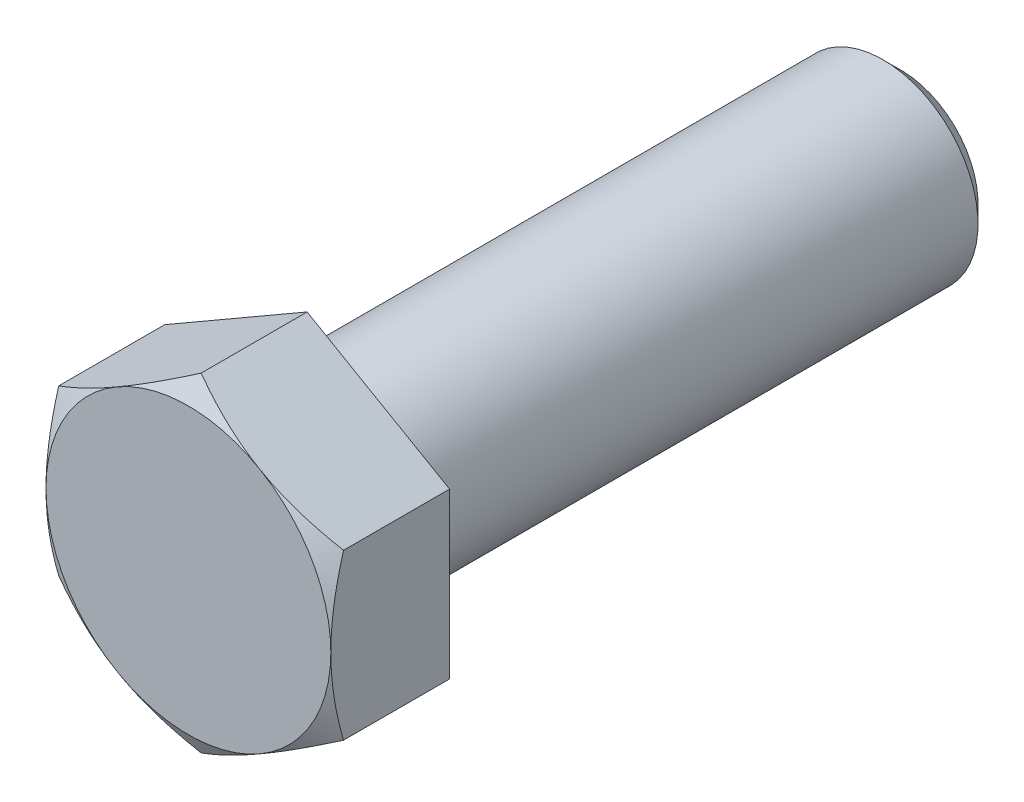
ISO-10303-21;
HEADER;
FILE_DESCRIPTION(('STEP AP214'),'2;1');
FILE_NAME('part.step','',(''),(''),'','','');
FILE_SCHEMA(('AUTOMOTIVE_DESIGN { 1 0 10303 214 1 1 1 1 }'));
ENDSEC;
DATA;
#1=APPLICATION_CONTEXT('core data for automotive mechanical design processes');
#2=APPLICATION_PROTOCOL_DEFINITION('international standard','automotive_design',2000,#1);
#3=PRODUCT_CONTEXT('',#1,'mechanical');
#4=PRODUCT('Part','Part','',(#3));
#5=PRODUCT_RELATED_PRODUCT_CATEGORY('part','',(#4));
#6=PRODUCT_DEFINITION_FORMATION('','',#4);
#7=PRODUCT_DEFINITION_CONTEXT('part definition',#1,'design');
#8=PRODUCT_DEFINITION('design','',#6,#7);
#9=PRODUCT_DEFINITION_SHAPE('','',#8);
#10=(LENGTH_UNIT() NAMED_UNIT(*) SI_UNIT(.MILLI.,.METRE.));
#11=(NAMED_UNIT(*) PLANE_ANGLE_UNIT() SI_UNIT($,.RADIAN.));
#12=(NAMED_UNIT(*) SI_UNIT($,.STERADIAN.) SOLID_ANGLE_UNIT());
#13=UNCERTAINTY_MEASURE_WITH_UNIT(LENGTH_MEASURE(1.E-05),#10,'distance_accuracy_value','');
#14=(GEOMETRIC_REPRESENTATION_CONTEXT(3) GLOBAL_UNCERTAINTY_ASSIGNED_CONTEXT((#13)) GLOBAL_UNIT_ASSIGNED_CONTEXT((#10,
#11,#12)) REPRESENTATION_CONTEXT('',''));
#15=CARTESIAN_POINT('',(0.,0.,0.));
#16=DIRECTION('',(0.,0.,1.));
#17=DIRECTION('',(1.,0.,0.));
#18=AXIS2_PLACEMENT_3D('',#15,#16,#17);
#19=CARTESIAN_POINT('',(-11.9944518424145,-6.925,9.99999999999999));
#20=DIRECTION('',(1.,0.,0.));
#21=DIRECTION('',(0.,0.,-1.));
#22=AXIS2_PLACEMENT_3D('',#19,#20,#21);
#23=PLANE('',#22);
#24=CARTESIAN_POINT('',(-11.9944518424145,-18.916651266714,3.99304255411589));
#25=CARTESIAN_POINT('',(-11.9944518424145,-18.65332713006,4.12143548843301));
#26=CARTESIAN_POINT('',(-11.9944518424145,-18.389702350382,4.24921154158443));
#27=CARTESIAN_POINT('',(-11.9944518424145,-17.8617888659462,4.50339074864757));
#28=CARTESIAN_POINT('',(-11.9944518424145,-17.5975001549837,4.62979388966998));
#29=CARTESIAN_POINT('',(-11.9944518424145,-16.8034779537679,5.00676659385935));
#30=CARTESIAN_POINT('',(-11.9944518424145,-16.2726616224978,5.2550636391158));
#31=CARTESIAN_POINT('',(-11.9944518424145,-15.2048398758484,5.74542434972927));
#32=CARTESIAN_POINT('',(-11.9944518424145,-14.6678166677863,5.98744935838821));
#33=CARTESIAN_POINT('',(-11.9944518424145,-13.5896076882344,6.46200912800229));
#34=CARTESIAN_POINT('',(-11.9944518424145,-13.0484221060183,6.69454431748629));
#35=CARTESIAN_POINT('',(-11.9944518424145,-11.9425225437582,7.15533366556412));
#36=CARTESIAN_POINT('',(-11.9944518424145,-11.3776347187372,7.38317268715597));
#37=CARTESIAN_POINT('',(-11.9944518424145,-10.2413641664025,7.82235885007693));
#38=CARTESIAN_POINT('',(-11.9944518424145,-9.66998073584954,8.03370418587514));
#39=CARTESIAN_POINT('',(-11.9944518424145,-8.5207984713068,8.43458178671425));
#40=CARTESIAN_POINT('',(-11.9944518424145,-7.94301423875377,8.624155586084));
#41=CARTESIAN_POINT('',(-11.9944518424145,-6.77911094521877,8.97562934069589));
#42=CARTESIAN_POINT('',(-11.9944518424145,-6.19299446892464,9.13753768334616));
#43=CARTESIAN_POINT('',(-11.9944518424145,-5.3090468338312,9.35351366164218));
#44=CARTESIAN_POINT('',(-11.9944518424145,-5.0144451577008,9.42087108481849));
#45=CARTESIAN_POINT('',(-11.9944518424145,-4.42317281629482,9.54584821699383));
#46=CARTESIAN_POINT('',(-11.9944518424145,-4.12650219029371,9.60346811031743));
#47=CARTESIAN_POINT('',(-11.9944518424145,-3.53127483954429,9.707973399711));
#48=CARTESIAN_POINT('',(-11.9944518424145,-3.23271816525139,9.75485908170252));
#49=CARTESIAN_POINT('',(-11.9944518424145,-2.63400739277033,9.83697403318311));
#50=CARTESIAN_POINT('',(-11.9944518424145,-2.33385336052829,9.872203780146));
#51=CARTESIAN_POINT('',(-11.9944518424145,-1.73642378819876,9.92984690973285));
#52=CARTESIAN_POINT('',(-11.9944518424145,-1.43916451574048,9.95242785114576));
#53=CARTESIAN_POINT('',(-11.9944518424145,-0.843956919887867,9.98498619836202));
#54=CARTESIAN_POINT('',(-11.9944518424145,-0.546008608519023,9.99496382248708));
#55=CARTESIAN_POINT('',(-11.9944518424145,0.050045912366901,10.0020764577051));
#56=CARTESIAN_POINT('',(-11.9944518424145,0.3481521227536,9.99921139731681));
#57=CARTESIAN_POINT('',(-11.9944518424145,0.943971065504699,9.9807119106433));
#58=CARTESIAN_POINT('',(-11.9944518424145,1.2416837798554,9.96507691875409));
#59=CARTESIAN_POINT('',(-11.9944518424145,1.94772756604727,9.91319318370986));
#60=CARTESIAN_POINT('',(-11.9944518424145,2.35566152514817,9.87141191806672));
#61=CARTESIAN_POINT('',(-11.9944518424145,3.16868715491053,9.76608269309506));
#62=CARTESIAN_POINT('',(-11.9944518424145,3.57377846766143,9.70253204129373));
#63=CARTESIAN_POINT('',(-11.9944518424145,4.78420967870067,9.48258089577494));
#64=CARTESIAN_POINT('',(-11.9944518424145,5.58431237319598,9.29691419933175));
#65=CARTESIAN_POINT('',(-11.9944518424145,6.78136342925836,8.97252727686722));
#66=CARTESIAN_POINT('',(-11.9944518424145,7.18444998983349,8.85513442526048));
#67=CARTESIAN_POINT('',(-11.9944518424145,7.98671422467023,8.6075562204289));
#68=CARTESIAN_POINT('',(-11.9944518424145,8.38589186846454,8.47737076758165));
#69=CARTESIAN_POINT('',(-11.9944518424145,9.180455481968,8.20634387181171));
#70=CARTESIAN_POINT('',(-11.9944518424145,9.57584246701539,8.06550537758821));
#71=CARTESIAN_POINT('',(-11.9944518424145,10.3633011529136,7.77489580880496));
#72=CARTESIAN_POINT('',(-11.9944518424145,10.7553729319294,7.62512494552452));
#73=CARTESIAN_POINT('',(-11.9944518424145,11.4819085933445,7.33958466234801));
#74=CARTESIAN_POINT('',(-11.9944518424145,11.8167566455457,7.204788583371));
#75=CARTESIAN_POINT('',(-11.9944518424145,12.484495230893,6.93042557144576));
#76=CARTESIAN_POINT('',(-11.9944518424145,12.81738573167,6.79085855986609));
#77=CARTESIAN_POINT('',(-11.9944518424145,13.8134888316028,6.36598374947554));
#78=CARTESIAN_POINT('',(-11.9944518424145,14.4740786475998,6.07452379938785));
#79=CARTESIAN_POINT('',(-11.9944518424145,15.7899072378391,5.47916602793451));
#80=CARTESIAN_POINT('',(-11.9944518424145,16.4451437864388,5.17526332056266));
#81=CARTESIAN_POINT('',(-11.9944518424145,17.7511030808341,4.55800113610587));
#82=CARTESIAN_POINT('',(-11.9944518424145,18.4018260159929,4.24464205873949));
#83=CARTESIAN_POINT('',(-11.9944518424145,19.7007256439382,3.61002539205532));
#84=CARTESIAN_POINT('',(-11.9944518424145,20.3488963895518,3.28875566096677));
#85=CARTESIAN_POINT('',(-11.9944518424145,21.642301806296,2.64035475241919));
#86=CARTESIAN_POINT('',(-11.9944518424145,22.2875364519682,2.31322352425692));
#87=CARTESIAN_POINT('',(-11.9944518424145,23.5754524501937,1.65433318539717));
#88=CARTESIAN_POINT('',(-11.9944518424145,24.2181343441847,1.32257513171498));
#89=CARTESIAN_POINT('',(-11.9944518424145,25.5015036164166,0.655232709957767));
#90=CARTESIAN_POINT('',(-11.9944518424145,26.1421910013197,0.319648354681224));
#91=CARTESIAN_POINT('',(-11.9944518424145,27.924670660146,-0.619563039909414));
#92=CARTESIAN_POINT('',(-11.9944518424145,29.0646553909012,-1.22661978018481));
#93=CARTESIAN_POINT('',(-11.9944518424145,31.3408166210456,-2.44798791954629));
#94=CARTESIAN_POINT('',(-11.9944518424145,32.4769928727079,-3.06229977922918));
#95=CARTESIAN_POINT('',(-11.9944518424145,34.7425242539032,-4.29421661781742));
#96=CARTESIAN_POINT('',(-11.9944518424145,35.8718894222397,-4.91180314694921));
#97=CARTESIAN_POINT('',(-11.9944518424145,37.5641951089027,-5.84124373526032));
#98=CARTESIAN_POINT('',(-11.9944518424145,38.1279841260959,-6.15155491387974));
#99=CARTESIAN_POINT('',(-11.9944518424145,39.2550572310404,-6.77309131560383));
#100=CARTESIAN_POINT('',(-11.9944518424145,39.818341319416,-7.08431653757636));
#101=CARTESIAN_POINT('',(-11.9944518424145,40.3814039491518,-7.39594200412859));
#102=B_SPLINE_CURVE_WITH_KNOTS('',3,(#24,#25,#26,#27,#28,#29,#30,#31,#32,#33,#34,#35,#36,#37,
#38,#39,#40,#41,#42,#43,#44,#45,#46,#47,#48,#49,#50,#51,#52,#53,#54,#55,#56,#57,#58,#59,#60,#61,
#62,#63,#64,#65,#66,#67,#68,#69,#70,#71,#72,#73,#74,#75,#76,#77,#78,#79,#80,#81,#82,#83,#84,#85,
#86,#87,#88,#89,#90,#91,#92,#93,#94,#95,#96,#97,#98,#99,#100,#101),.UNSPECIFIED.,.F.,.F.,(4,2,2,
2,2,2,2,2,2,2,2,2,2,2,2,2,2,2,2,2,2,2,2,2,2,2,2,2,2,2,2,2,2,2,2,2,2,2,4),(0.,0.878872284900839,
1.75775281379693,3.51575838735517,5.28281155622524,7.04978484232638,8.87690301414553,
10.7042209172107,12.5279927449866,14.3512106703107,15.2576873767629,16.1641469223283,
17.0705823201985,17.9769805822445,18.8710692294944,19.7651423886278,20.6592205241042,
21.5533382621126,22.7828544489863,24.0125227593446,26.4730415579406,27.7324269934589,
28.9918222372217,30.2508701545089,31.5098883030553,32.5927325496555,33.6755946516103,
35.841494368509,38.0082529021411,40.1749199753296,42.345150167211,44.5153991411365,
46.6851601814142,48.854913966255,52.7295018306159,56.604337012756,60.4659191891692,
62.396555713772,64.3271898480806),.UNSPECIFIED.);
#103=CARTESIAN_POINT('',(-11.9944518424145,6.925,8.92869877172368));
#104=VERTEX_POINT('',#103);
#105=CARTESIAN_POINT('',(-11.9944518424145,0.,9.99999999999999));
#106=VERTEX_POINT('',#105);
#107=EDGE_CURVE('E121',#104,#106,#102,.F.);
#108=ORIENTED_EDGE('',*,*,#107,.F.);
#109=DIRECTION('',(0.,0.,-1.));
#110=VECTOR('',#109,1.);
#111=CARTESIAN_POINT('',(-11.9944518424145,6.925,9.99999999999999));
#112=LINE('',#111,#110);
#113=CARTESIAN_POINT('',(-11.9944518424145,6.925,0.));
#114=VERTEX_POINT('',#113);
#115=EDGE_CURVE('E336',#104,#114,#112,.T.);
#116=ORIENTED_EDGE('',*,*,#115,.T.);
#117=DIRECTION('',(0.,-1.,0.));
#118=VECTOR('',#117,1.);
#119=CARTESIAN_POINT('',(-11.9944518424145,-6.925,0.));
#120=LINE('',#119,#118);
#121=CARTESIAN_POINT('',(-11.9944518424145,-6.925,0.));
#122=VERTEX_POINT('',#121);
#123=EDGE_CURVE('E133',#114,#122,#120,.T.);
#124=ORIENTED_EDGE('',*,*,#123,.T.);
#125=DIRECTION('',(0.,0.,-1.));
#126=VECTOR('',#125,1.);
#127=CARTESIAN_POINT('',(-11.9944518424145,-6.925,9.99999999999999));
#128=LINE('',#127,#126);
#129=CARTESIAN_POINT('',(-11.9944518424145,-6.925,8.92869877172368));
#130=VERTEX_POINT('',#129);
#131=EDGE_CURVE('E148',#130,#122,#128,.T.);
#132=ORIENTED_EDGE('',*,*,#131,.F.);
#133=EDGE_CURVE('E134',#106,#130,#102,.F.);
#134=ORIENTED_EDGE('',*,*,#133,.F.);
#135=EDGE_LOOP('',(#108,#116,#124,#132,#134));
#136=FACE_BOUND('',#135,.T.);
#137=ADVANCED_FACE('F48',(#136),#23,.F.);
#138=CARTESIAN_POINT('',(0.,-13.85,9.99999999999999));
#139=DIRECTION('',(0.5,0.866025403784439,0.));
#140=DIRECTION('',(-0.866025403784439,0.5,0.));
#141=AXIS2_PLACEMENT_3D('',#138,#139,#140);
#142=PLANE('',#141);
#143=CARTESIAN_POINT('',(-11.9946518424145,-6.92488452994616,8.92863210422332));
#144=CARTESIAN_POINT('',(-11.7309880068237,-7.0771109164001,9.01650526390025));
#145=CARTESIAN_POINT('',(-11.4663410970628,-7.2299048809907,9.10039009803979));
#146=CARTESIAN_POINT('',(-10.9349250103329,-7.5367181017159,9.25907647737003));
#147=CARTESIAN_POINT('',(-10.6681551659175,-7.69073774320083,9.33387503508725));
#148=CARTESIAN_POINT('',(-9.86354719447097,-8.15527837210761,9.54319374056303));
#149=CARTESIAN_POINT('',(-9.32253277670568,-8.46763319183987,9.66225297451029));
#150=CARTESIAN_POINT('',(-8.51292950912907,-8.93505785631203,9.80186057760396));
#151=CARTESIAN_POINT('',(-8.24675935675103,-9.08873126543773,9.84162944747569));
#152=CARTESIAN_POINT('',(-7.71318666643687,-9.39678960182285,9.90831903015149));
#153=CARTESIAN_POINT('',(-7.44578410488022,-9.55117454271957,9.93523949565864));
#154=CARTESIAN_POINT('',(-6.91053317187236,-9.86020181297565,9.97554271658336));
#155=CARTESIAN_POINT('',(-6.64268571084417,-10.014843616702,9.98894155919328));
#156=CARTESIAN_POINT('',(-6.10674260481726,-10.324270513237,10.0019160194629));
#157=CARTESIAN_POINT('',(-5.83864696774281,-10.4790556014705,10.0014920642289));
#158=CARTESIAN_POINT('',(-5.33744179757746,-10.7684265413847,9.98778563339743));
#159=CARTESIAN_POINT('',(-5.1042965200804,-10.9030330301079,9.97617504133638));
#160=CARTESIAN_POINT('',(-4.63854219728805,-11.1719364137483,9.94271849124255));
#161=CARTESIAN_POINT('',(-4.40593319109304,-11.3062332860909,9.9208718092088));
#162=CARTESIAN_POINT('',(-3.94137782301578,-11.5744444529038,9.86732395734743));
#163=CARTESIAN_POINT('',(-3.70943216871743,-11.7083583388503,9.83561464821631));
#164=CARTESIAN_POINT('',(-3.2466282748813,-11.9755582915386,9.76289789906763));
#165=CARTESIAN_POINT('',(-3.01577011034418,-12.1088443149788,9.72188982705705));
#166=CARTESIAN_POINT('',(-2.31498719592915,-12.5134415192598,9.58388082194164));
#167=CARTESIAN_POINT('',(-1.84709182423662,-12.783581038059,9.47311881686755));
#168=CARTESIAN_POINT('',(-0.918278067766464,-13.3198319103841,9.22173420899584));
#169=CARTESIAN_POINT('',(-0.457347790585423,-13.5859501299922,9.08117064671574));
#170=CARTESIAN_POINT('',(0.000200000000005751,-13.8501154700538,8.9286321042233));
#171=B_SPLINE_CURVE_WITH_KNOTS('',3,(#143,#144,#145,#146,#147,#148,#149,#150,#151,#152,#153,
#154,#155,#156,#157,#158,#159,#160,#161,#162,#163,#164,#165,#166,#167,#168,#169,#170),
.UNSPECIFIED.,.F.,.F.,(4,2,2,2,2,2,2,2,2,2,2,2,2,4),(0.,0.950565182162973,1.90144205921183,
3.80724359659026,4.73675449755258,5.66628328835706,6.59470487475382,7.52309777417093,
8.33129276431406,9.13954492690338,9.94846589136071,10.7574418508433,12.410969629216,
14.0612516767978),.UNSPECIFIED.);
#172=CARTESIAN_POINT('',(-5.99722592120724,-10.3875,9.99999999999999));
#173=VERTEX_POINT('',#172);
#174=EDGE_CURVE('E142',#130,#173,#171,.T.);
#175=ORIENTED_EDGE('',*,*,#174,.F.);
#176=ORIENTED_EDGE('',*,*,#131,.T.);
#177=DIRECTION('',(0.866025403784439,-0.5,0.));
#178=VECTOR('',#177,1.);
#179=CARTESIAN_POINT('',(0.,-13.85,0.));
#180=LINE('',#179,#178);
#181=CARTESIAN_POINT('',(0.,-13.85,0.));
#182=VERTEX_POINT('',#181);
#183=EDGE_CURVE('E480',#122,#182,#180,.T.);
#184=ORIENTED_EDGE('',*,*,#183,.T.);
#185=DIRECTION('',(0.,0.,-1.));
#186=VECTOR('',#185,1.);
#187=CARTESIAN_POINT('',(0.,-13.85,9.99999999999999));
#188=LINE('',#187,#186);
#189=CARTESIAN_POINT('',(0.,-13.85,8.92869877172368));
#190=VERTEX_POINT('',#189);
#191=EDGE_CURVE('E233',#190,#182,#188,.T.);
#192=ORIENTED_EDGE('',*,*,#191,.F.);
#193=EDGE_CURVE('E160',#173,#190,#171,.T.);
#194=ORIENTED_EDGE('',*,*,#193,.F.);
#195=EDGE_LOOP('',(#175,#176,#184,#192,#194));
#196=FACE_BOUND('',#195,.T.);
#197=ADVANCED_FACE('F221',(#196),#142,.F.);
#198=CARTESIAN_POINT('',(11.9944518424145,-6.925,9.99999999999999));
#199=DIRECTION('',(-0.5,0.866025403784439,0.));
#200=DIRECTION('',(-0.866025403784439,-0.5,0.));
#201=AXIS2_PLACEMENT_3D('',#198,#199,#200);
#202=PLANE('',#201);
#203=CARTESIAN_POINT('',(-0.000200000000005751,-13.8501154700538,8.9286321042233));
#204=CARTESIAN_POINT('',(0.263463835590822,-13.6978890835999,9.01650526390024));
#205=CARTESIAN_POINT('',(0.528110745351635,-13.5450951190093,9.10039009803979));
#206=CARTESIAN_POINT('',(1.05952683208153,-13.2382818982841,9.25907647737003));
#207=CARTESIAN_POINT('',(1.32629667649696,-13.0842622567992,9.33387503508725));
#208=CARTESIAN_POINT('',(2.13090464794351,-12.6197216278924,9.54319374056303));
#209=CARTESIAN_POINT('',(2.67191906570879,-12.3073668081601,9.66225297451029));
#210=CARTESIAN_POINT('',(3.48152233328541,-11.839942143688,9.80186057760396));
#211=CARTESIAN_POINT('',(3.74769248566345,-11.6862687345623,9.84162944747569));
#212=CARTESIAN_POINT('',(4.28126517597761,-11.3782103981772,9.90831903015149));
#213=CARTESIAN_POINT('',(4.54866773753425,-11.2238254572804,9.93523949565864));
#214=CARTESIAN_POINT('',(5.08391867054211,-10.9147981870244,9.97554271658336));
#215=CARTESIAN_POINT('',(5.3517661315703,-10.760156383298,9.98894155919328));
#216=CARTESIAN_POINT('',(5.88770923759721,-10.450729486763,10.0019160194629));
#217=CARTESIAN_POINT('',(6.15580487467166,-10.2959443985295,10.0014920642289));
#218=CARTESIAN_POINT('',(6.65701004483701,-10.0065734586153,9.98778563339743));
#219=CARTESIAN_POINT('',(6.89015532233408,-9.87196696989209,9.97617504133638));
#220=CARTESIAN_POINT('',(7.35590964512643,-9.6030635862517,9.94271849124255));
#221=CARTESIAN_POINT('',(7.58851865132143,-9.46876671390908,9.9208718092088));
#222=CARTESIAN_POINT('',(8.05307401939869,-9.20055554709618,9.86732395734743));
#223=CARTESIAN_POINT('',(8.28501967369704,-9.06664166114967,9.83561464821631));
#224=CARTESIAN_POINT('',(8.74782356753318,-8.79944170846137,9.76289789906763));
#225=CARTESIAN_POINT('',(8.9786817320703,-8.66615568502124,9.72188982705706));
#226=CARTESIAN_POINT('',(9.67946464648532,-8.26155848074024,9.58388082194163));
#227=CARTESIAN_POINT('',(10.1473600181779,-7.99141896194097,9.47311881686755));
#228=CARTESIAN_POINT('',(11.076173774648,-7.4551680896159,9.22173420899584));
#229=CARTESIAN_POINT('',(11.537104051829,-7.18904987000778,9.08117064671575));
#230=CARTESIAN_POINT('',(11.9946518424145,-6.92488452994616,8.92863210422332));
#231=B_SPLINE_CURVE_WITH_KNOTS('',3,(#203,#204,#205,#206,#207,#208,#209,#210,#211,#212,#213,
#214,#215,#216,#217,#218,#219,#220,#221,#222,#223,#224,#225,#226,#227,#228,#229,#230),
.UNSPECIFIED.,.F.,.F.,(4,2,2,2,2,2,2,2,2,2,2,2,2,4),(0.,0.950565182162975,1.90144205921183,
3.80724359659026,4.73675449755258,5.66628328835706,6.59470487475382,7.52309777417093,
8.33129276431407,9.13954492690339,9.94846589136071,10.7574418508433,12.410969629216,
14.0612516767978),.UNSPECIFIED.);
#232=CARTESIAN_POINT('',(5.99722592120724,-10.3875,9.99999999999999));
#233=VERTEX_POINT('',#232);
#234=EDGE_CURVE('E216',#190,#233,#231,.T.);
#235=ORIENTED_EDGE('',*,*,#234,.F.);
#236=ORIENTED_EDGE('',*,*,#191,.T.);
#237=DIRECTION('',(0.866025403784438,0.5,0.));
#238=VECTOR('',#237,1.);
#239=CARTESIAN_POINT('',(11.9944518424145,-6.925,0.));
#240=LINE('',#239,#238);
#241=CARTESIAN_POINT('',(11.9944518424145,-6.925,0.));
#242=VERTEX_POINT('',#241);
#243=EDGE_CURVE('E252',#182,#242,#240,.T.);
#244=ORIENTED_EDGE('',*,*,#243,.T.);
#245=DIRECTION('',(0.,0.,-1.));
#246=VECTOR('',#245,1.);
#247=CARTESIAN_POINT('',(11.9944518424145,-6.925,9.99999999999999));
#248=LINE('',#247,#246);
#249=CARTESIAN_POINT('',(11.9944518424145,-6.925,8.92869877172368));
#250=VERTEX_POINT('',#249);
#251=EDGE_CURVE('E250',#250,#242,#248,.T.);
#252=ORIENTED_EDGE('',*,*,#251,.F.);
#253=EDGE_CURVE('E209',#233,#250,#231,.T.);
#254=ORIENTED_EDGE('',*,*,#253,.F.);
#255=EDGE_LOOP('',(#235,#236,#244,#252,#254));
#256=FACE_BOUND('',#255,.T.);
#257=ADVANCED_FACE('F217',(#256),#202,.F.);
#258=CARTESIAN_POINT('',(11.9944518424145,6.925,9.99999999999999));
#259=DIRECTION('',(-1.,0.,0.));
#260=DIRECTION('',(0.,-1.,0.));
#261=AXIS2_PLACEMENT_3D('',#258,#259,#260);
#262=PLANE('',#261);
#263=CARTESIAN_POINT('',(11.9944518424145,-18.916651266714,3.99304255411589));
#264=CARTESIAN_POINT('',(11.9944518424145,-18.65332713006,4.12143548843301));
#265=CARTESIAN_POINT('',(11.9944518424145,-18.389702350382,4.24921154158444));
#266=CARTESIAN_POINT('',(11.9944518424145,-17.8617888659462,4.50339074864758));
#267=CARTESIAN_POINT('',(11.9944518424145,-17.5975001549837,4.62979388966999));
#268=CARTESIAN_POINT('',(11.9944518424145,-16.8034779537679,5.00676659385936));
#269=CARTESIAN_POINT('',(11.9944518424145,-16.2726616224978,5.2550636391158));
#270=CARTESIAN_POINT('',(11.9944518424145,-15.2048398758484,5.74542434972927));
#271=CARTESIAN_POINT('',(11.9944518424145,-14.6678166677863,5.98744935838821));
#272=CARTESIAN_POINT('',(11.9944518424145,-13.5896076882344,6.4620091280023));
#273=CARTESIAN_POINT('',(11.9944518424145,-13.0484221060183,6.69454431748629));
#274=CARTESIAN_POINT('',(11.9944518424145,-11.9425225437582,7.15533366556412));
#275=CARTESIAN_POINT('',(11.9944518424145,-11.3776347187372,7.38317268715597));
#276=CARTESIAN_POINT('',(11.9944518424145,-10.2413641664025,7.82235885007693));
#277=CARTESIAN_POINT('',(11.9944518424145,-9.66998073584954,8.03370418587514));
#278=CARTESIAN_POINT('',(11.9944518424145,-8.5207984713068,8.43458178671425));
#279=CARTESIAN_POINT('',(11.9944518424145,-7.94301423875377,8.624155586084));
#280=CARTESIAN_POINT('',(11.9944518424145,-6.77911094521877,8.97562934069589));
#281=CARTESIAN_POINT('',(11.9944518424145,-6.19299446892464,9.13753768334616));
#282=CARTESIAN_POINT('',(11.9944518424145,-5.3090468338312,9.35351366164218));
#283=CARTESIAN_POINT('',(11.9944518424145,-5.0144451577008,9.42087108481849));
#284=CARTESIAN_POINT('',(11.9944518424145,-4.42317281629482,9.54584821699383));
#285=CARTESIAN_POINT('',(11.9944518424145,-4.1265021902937,9.60346811031743));
#286=CARTESIAN_POINT('',(11.9944518424145,-3.53127483954429,9.707973399711));
#287=CARTESIAN_POINT('',(11.9944518424145,-3.23271816525138,9.75485908170252));
#288=CARTESIAN_POINT('',(11.9944518424145,-2.63400739277033,9.83697403318311));
#289=CARTESIAN_POINT('',(11.9944518424145,-2.33385336052829,9.872203780146));
#290=CARTESIAN_POINT('',(11.9944518424145,-1.73642378819876,9.92984690973285));
#291=CARTESIAN_POINT('',(11.9944518424145,-1.43916451574048,9.95242785114576));
#292=CARTESIAN_POINT('',(11.9944518424145,-0.84395691988787,9.98498619836202));
#293=CARTESIAN_POINT('',(11.9944518424145,-0.546008608519025,9.99496382248708));
#294=CARTESIAN_POINT('',(11.9944518424145,0.0500459123668988,10.0020764577051));
#295=CARTESIAN_POINT('',(11.9944518424145,0.348152122753597,9.99921139731681));
#296=CARTESIAN_POINT('',(11.9944518424145,0.943971065504697,9.9807119106433));
#297=CARTESIAN_POINT('',(11.9944518424145,1.2416837798554,9.96507691875409));
#298=CARTESIAN_POINT('',(11.9944518424145,1.94772756604726,9.91319318370986));
#299=CARTESIAN_POINT('',(11.9944518424145,2.35566152514817,9.87141191806672));
#300=CARTESIAN_POINT('',(11.9944518424145,3.16868715491053,9.76608269309506));
#301=CARTESIAN_POINT('',(11.9944518424145,3.57377846766143,9.70253204129374));
#302=CARTESIAN_POINT('',(11.9944518424145,4.78420967870067,9.48258089577494));
#303=CARTESIAN_POINT('',(11.9944518424145,5.58431237319598,9.29691419933175));
#304=CARTESIAN_POINT('',(11.9944518424145,6.78136342925836,8.97252727686722));
#305=CARTESIAN_POINT('',(11.9944518424145,7.18444998983349,8.85513442526048));
#306=CARTESIAN_POINT('',(11.9944518424145,7.98671422467023,8.6075562204289));
#307=CARTESIAN_POINT('',(11.9944518424145,8.38589186846454,8.47737076758165));
#308=CARTESIAN_POINT('',(11.9944518424145,9.180455481968,8.20634387181171));
#309=CARTESIAN_POINT('',(11.9944518424145,9.57584246701539,8.06550537758822));
#310=CARTESIAN_POINT('',(11.9944518424145,10.3633011529136,7.77489580880496));
#311=CARTESIAN_POINT('',(11.9944518424145,10.7553729319294,7.62512494552451));
#312=CARTESIAN_POINT('',(11.9944518424145,11.4819085933445,7.33958466234801));
#313=CARTESIAN_POINT('',(11.9944518424145,11.8167566455456,7.204788583371));
#314=CARTESIAN_POINT('',(11.9944518424145,12.484495230893,6.93042557144577));
#315=CARTESIAN_POINT('',(11.9944518424145,12.81738573167,6.7908585598661));
#316=CARTESIAN_POINT('',(11.9944518424145,13.8134888316028,6.36598374947554));
#317=CARTESIAN_POINT('',(11.9944518424145,14.4740786475998,6.07452379938785));
#318=CARTESIAN_POINT('',(11.9944518424145,15.7899072378391,5.47916602793451));
#319=CARTESIAN_POINT('',(11.9944518424145,16.4451437864388,5.17526332056267));
#320=CARTESIAN_POINT('',(11.9944518424145,17.7511030808341,4.55800113610587));
#321=CARTESIAN_POINT('',(11.9944518424145,18.4018260159929,4.24464205873949));
#322=CARTESIAN_POINT('',(11.9944518424145,19.7007256439382,3.61002539205532));
#323=CARTESIAN_POINT('',(11.9944518424145,20.3488963895518,3.28875566096677));
#324=CARTESIAN_POINT('',(11.9944518424145,21.642301806296,2.64035475241919));
#325=CARTESIAN_POINT('',(11.9944518424145,22.2875364519682,2.31322352425692));
#326=CARTESIAN_POINT('',(11.9944518424145,23.5754524501937,1.65433318539717));
#327=CARTESIAN_POINT('',(11.9944518424145,24.2181343441847,1.32257513171498));
#328=CARTESIAN_POINT('',(11.9944518424145,25.5015036164166,0.655232709957769));
#329=CARTESIAN_POINT('',(11.9944518424145,26.1421910013197,0.319648354681223));
#330=CARTESIAN_POINT('',(11.9944518424145,27.924670660146,-0.619563039909421));
#331=CARTESIAN_POINT('',(11.9944518424145,29.0646553909013,-1.22661978018482));
#332=CARTESIAN_POINT('',(11.9944518424145,31.3408166210456,-2.4479879195463));
#333=CARTESIAN_POINT('',(11.9944518424145,32.4769928727079,-3.06229977922919));
#334=CARTESIAN_POINT('',(11.9944518424145,34.7425242539032,-4.29421661781742));
#335=CARTESIAN_POINT('',(11.9944518424145,35.8718894222397,-4.91180314694922));
#336=CARTESIAN_POINT('',(11.9944518424145,37.5641951089027,-5.84124373526032));
#337=CARTESIAN_POINT('',(11.9944518424145,38.1279841260959,-6.15155491387975));
#338=CARTESIAN_POINT('',(11.9944518424145,39.2550572310404,-6.77309131560384));
#339=CARTESIAN_POINT('',(11.9944518424145,39.818341319416,-7.08431653757636));
#340=CARTESIAN_POINT('',(11.9944518424145,40.3814039491518,-7.3959420041286));
#341=B_SPLINE_CURVE_WITH_KNOTS('',3,(#263,#264,#265,#266,#267,#268,#269,#270,#271,#272,#273,
#274,#275,#276,#277,#278,#279,#280,#281,#282,#283,#284,#285,#286,#287,#288,#289,#290,#291,#292,
#293,#294,#295,#296,#297,#298,#299,#300,#301,#302,#303,#304,#305,#306,#307,#308,#309,#310,#311,
#312,#313,#314,#315,#316,#317,#318,#319,#320,#321,#322,#323,#324,#325,#326,#327,#328,#329,#330,
#331,#332,#333,#334,#335,#336,#337,#338,#339,#340),.UNSPECIFIED.,.F.,.F.,(4,2,2,2,2,2,2,2,2,2,2,
2,2,2,2,2,2,2,2,2,2,2,2,2,2,2,2,2,2,2,2,2,2,2,2,2,2,2,4),(0.,0.878872284900841,1.75775281379692,
3.51575838735517,5.28281155622523,7.04978484232637,8.87690301414553,10.7042209172107,
12.5279927449866,14.3512106703107,15.2576873767629,16.1641469223283,17.0705823201985,
17.9769805822445,18.8710692294944,19.7651423886278,20.6592205241042,21.5533382621126,
22.7828544489863,24.0125227593446,26.4730415579406,27.7324269934589,28.9918222372217,
30.2508701545089,31.5098883030553,32.5927325496555,33.6755946516103,35.841494368509,
38.0082529021411,40.1749199753296,42.345150167211,44.5153991411365,46.6851601814142,
48.854913966255,52.7295018306159,56.604337012756,60.4659191891692,62.396555713772,
64.3271898480806),.UNSPECIFIED.);
#342=CARTESIAN_POINT('',(11.9944518424145,0.,9.99999999999999));
#343=VERTEX_POINT('',#342);
#344=EDGE_CURVE('E72',#250,#343,#341,.T.);
#345=ORIENTED_EDGE('',*,*,#344,.F.);
#346=ORIENTED_EDGE('',*,*,#251,.T.);
#347=DIRECTION('',(0.,1.,0.));
#348=VECTOR('',#347,1.);
#349=CARTESIAN_POINT('',(11.9944518424145,6.925,0.));
#350=LINE('',#349,#348);
#351=CARTESIAN_POINT('',(11.9944518424145,6.925,0.));
#352=VERTEX_POINT('',#351);
#353=EDGE_CURVE('E322',#242,#352,#350,.T.);
#354=ORIENTED_EDGE('',*,*,#353,.T.);
#355=DIRECTION('',(0.,0.,-1.));
#356=VECTOR('',#355,1.);
#357=CARTESIAN_POINT('',(11.9944518424145,6.925,9.99999999999999));
#358=LINE('',#357,#356);
#359=CARTESIAN_POINT('',(11.9944518424145,6.925,8.92869877172368));
#360=VERTEX_POINT('',#359);
#361=EDGE_CURVE('E257',#360,#352,#358,.T.);
#362=ORIENTED_EDGE('',*,*,#361,.F.);
#363=EDGE_CURVE('E203',#343,#360,#341,.T.);
#364=ORIENTED_EDGE('',*,*,#363,.F.);
#365=EDGE_LOOP('',(#345,#346,#354,#362,#364));
#366=FACE_BOUND('',#365,.T.);
#367=ADVANCED_FACE('F220',(#366),#262,.F.);
#368=CARTESIAN_POINT('',(0.,13.85,9.99999999999999));
#369=DIRECTION('',(-0.5,-0.866025403784439,0.));
#370=DIRECTION('',(0.866025403784439,-0.5,0.));
#371=AXIS2_PLACEMENT_3D('',#368,#369,#370);
#372=PLANE('',#371);
#373=CARTESIAN_POINT('',(11.9946518424145,6.92488452994616,8.92863210422332));
#374=CARTESIAN_POINT('',(11.7309880068237,7.0771109164001,9.01650526390025));
#375=CARTESIAN_POINT('',(11.4663410970628,7.2299048809907,9.10039009803979));
#376=CARTESIAN_POINT('',(10.9349250103329,7.5367181017159,9.25907647737003));
#377=CARTESIAN_POINT('',(10.6681551659175,7.69073774320083,9.33387503508725));
#378=CARTESIAN_POINT('',(9.86354719447097,8.15527837210761,9.54319374056303));
#379=CARTESIAN_POINT('',(9.32253277670568,8.46763319183987,9.66225297451029));
#380=CARTESIAN_POINT('',(8.51292950912906,8.93505785631203,9.80186057760396));
#381=CARTESIAN_POINT('',(8.24675935675103,9.08873126543773,9.84162944747569));
#382=CARTESIAN_POINT('',(7.71318666643687,9.39678960182285,9.90831903015149));
#383=CARTESIAN_POINT('',(7.44578410488022,9.55117454271957,9.93523949565864));
#384=CARTESIAN_POINT('',(6.91053317187236,9.86020181297565,9.97554271658336));
#385=CARTESIAN_POINT('',(6.64268571084417,10.014843616702,9.98894155919328));
#386=CARTESIAN_POINT('',(6.10674260481726,10.324270513237,10.0019160194629));
#387=CARTESIAN_POINT('',(5.83864696774281,10.4790556014705,10.0014920642289));
#388=CARTESIAN_POINT('',(5.33744179757746,10.7684265413847,9.98778563339743));
#389=CARTESIAN_POINT('',(5.10429652008039,10.9030330301079,9.97617504133638));
#390=CARTESIAN_POINT('',(4.63854219728805,11.1719364137483,9.94271849124255));
#391=CARTESIAN_POINT('',(4.40593319109304,11.3062332860909,9.9208718092088));
#392=CARTESIAN_POINT('',(3.94137782301578,11.5744444529038,9.86732395734743));
#393=CARTESIAN_POINT('',(3.70943216871743,11.7083583388503,9.83561464821631));
#394=CARTESIAN_POINT('',(3.24662827488129,11.9755582915386,9.76289789906763));
#395=CARTESIAN_POINT('',(3.01577011034418,12.1088443149788,9.72188982705705));
#396=CARTESIAN_POINT('',(2.31498719592915,12.5134415192598,9.58388082194164));
#397=CARTESIAN_POINT('',(1.84709182423662,12.783581038059,9.47311881686755));
#398=CARTESIAN_POINT('',(0.918278067766465,13.3198319103841,9.22173420899584));
#399=CARTESIAN_POINT('',(0.457347790585422,13.5859501299922,9.08117064671574));
#400=CARTESIAN_POINT('',(-0.000200000000005751,13.8501154700538,8.9286321042233));
#401=B_SPLINE_CURVE_WITH_KNOTS('',3,(#373,#374,#375,#376,#377,#378,#379,#380,#381,#382,#383,
#384,#385,#386,#387,#388,#389,#390,#391,#392,#393,#394,#395,#396,#397,#398,#399,#400),
.UNSPECIFIED.,.F.,.F.,(4,2,2,2,2,2,2,2,2,2,2,2,2,4),(0.,0.950565182162973,1.90144205921183,
3.80724359659026,4.73675449755258,5.66628328835706,6.59470487475383,7.52309777417093,
8.33129276431407,9.13954492690339,9.94846589136071,10.7574418508433,12.410969629216,
14.0612516767978),.UNSPECIFIED.);
#402=CARTESIAN_POINT('',(5.99722592120724,10.3875,9.99999999999999));
#403=VERTEX_POINT('',#402);
#404=EDGE_CURVE('E64',#360,#403,#401,.T.);
#405=ORIENTED_EDGE('',*,*,#404,.F.);
#406=ORIENTED_EDGE('',*,*,#361,.T.);
#407=DIRECTION('',(-0.866025403784439,0.5,0.));
#408=VECTOR('',#407,1.);
#409=CARTESIAN_POINT('',(0.,13.85,0.));
#410=LINE('',#409,#408);
#411=CARTESIAN_POINT('',(0.,13.85,0.));
#412=VERTEX_POINT('',#411);
#413=EDGE_CURVE('E326',#352,#412,#410,.T.);
#414=ORIENTED_EDGE('',*,*,#413,.T.);
#415=DIRECTION('',(0.,0.,-1.));
#416=VECTOR('',#415,1.);
#417=CARTESIAN_POINT('',(0.,13.85,9.99999999999999));
#418=LINE('',#417,#416);
#419=CARTESIAN_POINT('',(0.,13.85,8.92869877172368));
#420=VERTEX_POINT('',#419);
#421=EDGE_CURVE('E263',#420,#412,#418,.T.);
#422=ORIENTED_EDGE('',*,*,#421,.F.);
#423=EDGE_CURVE('E195',#403,#420,#401,.T.);
#424=ORIENTED_EDGE('',*,*,#423,.F.);
#425=EDGE_LOOP('',(#405,#406,#414,#422,#424));
#426=FACE_BOUND('',#425,.T.);
#427=ADVANCED_FACE('F309',(#426),#372,.F.);
#428=CARTESIAN_POINT('',(-11.9944518424145,6.925,9.99999999999999));
#429=DIRECTION('',(0.5,-0.866025403784439,0.));
#430=DIRECTION('',(0.866025403784439,0.5,0.));
#431=AXIS2_PLACEMENT_3D('',#428,#429,#430);
#432=PLANE('',#431);
#433=CARTESIAN_POINT('',(0.000200000000005751,13.8501154700538,8.9286321042233));
#434=CARTESIAN_POINT('',(-0.263463835590822,13.6978890835999,9.01650526390024));
#435=CARTESIAN_POINT('',(-0.528110745351636,13.5450951190093,9.10039009803979));
#436=CARTESIAN_POINT('',(-1.05952683208153,13.2382818982841,9.25907647737003));
#437=CARTESIAN_POINT('',(-1.32629667649696,13.0842622567992,9.33387503508725));
#438=CARTESIAN_POINT('',(-2.13090464794351,12.6197216278924,9.54319374056303));
#439=CARTESIAN_POINT('',(-2.6719190657088,12.3073668081601,9.66225297451029));
#440=CARTESIAN_POINT('',(-3.48152233328541,11.839942143688,9.80186057760396));
#441=CARTESIAN_POINT('',(-3.74769248566345,11.6862687345623,9.84162944747569));
#442=CARTESIAN_POINT('',(-4.28126517597761,11.3782103981772,9.90831903015149));
#443=CARTESIAN_POINT('',(-4.54866773753426,11.2238254572804,9.93523949565864));
#444=CARTESIAN_POINT('',(-5.08391867054211,10.9147981870243,9.97554271658336));
#445=CARTESIAN_POINT('',(-5.3517661315703,10.760156383298,9.98894155919328));
#446=CARTESIAN_POINT('',(-5.88770923759722,10.450729486763,10.0019160194629));
#447=CARTESIAN_POINT('',(-6.15580487467168,10.2959443985295,10.0014920642289));
#448=CARTESIAN_POINT('',(-6.65701004483703,10.0065734586153,9.98778563339743));
#449=CARTESIAN_POINT('',(-6.89015532233409,9.87196696989209,9.97617504133638));
#450=CARTESIAN_POINT('',(-7.35590964512643,9.60306358625169,9.94271849124255));
#451=CARTESIAN_POINT('',(-7.58851865132144,9.46876671390907,9.9208718092088));
#452=CARTESIAN_POINT('',(-8.0530740193987,9.20055554709618,9.86732395734743));
#453=CARTESIAN_POINT('',(-8.28501967369704,9.06664166114967,9.83561464821631));
#454=CARTESIAN_POINT('',(-8.74782356753318,8.79944170846136,9.76289789906763));
#455=CARTESIAN_POINT('',(-8.9786817320703,8.66615568502124,9.72188982705705));
#456=CARTESIAN_POINT('',(-9.67946464648532,8.26155848074023,9.58388082194163));
#457=CARTESIAN_POINT('',(-10.1473600181779,7.99141896194097,9.47311881686755));
#458=CARTESIAN_POINT('',(-11.076173774648,7.4551680896159,9.22173420899584));
#459=CARTESIAN_POINT('',(-11.5371040518291,7.18904987000778,9.08117064671575));
#460=CARTESIAN_POINT('',(-11.9946518424145,6.92488452994616,8.9286321042233));
#461=B_SPLINE_CURVE_WITH_KNOTS('',3,(#433,#434,#435,#436,#437,#438,#439,#440,#441,#442,#443,
#444,#445,#446,#447,#448,#449,#450,#451,#452,#453,#454,#455,#456,#457,#458,#459,#460),
.UNSPECIFIED.,.F.,.F.,(4,2,2,2,2,2,2,2,2,2,2,2,2,4),(0.,0.950565182162975,1.90144205921183,
3.80724359659027,4.73675449755259,5.66628328835707,6.59470487475383,7.52309777417094,
8.33129276431407,9.13954492690339,9.94846589136072,10.7574418508433,12.410969629216,
14.0612516767978),.UNSPECIFIED.);
#462=CARTESIAN_POINT('',(-5.99722592120724,10.3875,9.99999999999999));
#463=VERTEX_POINT('',#462);
#464=EDGE_CURVE('E344',#420,#463,#461,.T.);
#465=ORIENTED_EDGE('',*,*,#464,.F.);
#466=ORIENTED_EDGE('',*,*,#421,.T.);
#467=DIRECTION('',(-0.866025403784439,-0.5,0.));
#468=VECTOR('',#467,1.);
#469=CARTESIAN_POINT('',(-11.9944518424145,6.925,0.));
#470=LINE('',#469,#468);
#471=EDGE_CURVE('E331',#412,#114,#470,.T.);
#472=ORIENTED_EDGE('',*,*,#471,.T.);
#473=ORIENTED_EDGE('',*,*,#115,.F.);
#474=EDGE_CURVE('E128',#463,#104,#461,.T.);
#475=ORIENTED_EDGE('',*,*,#474,.F.);
#476=EDGE_LOOP('',(#465,#466,#472,#473,#475));
#477=FACE_BOUND('',#476,.T.);
#478=ADVANCED_FACE('F306',(#477),#432,.F.);
#479=CARTESIAN_POINT('',(-11.9944518424145,6.925,0.));
#480=DIRECTION('',(0.,0.,-1.));
#481=DIRECTION('',(-1.,0.,0.));
#482=AXIS2_PLACEMENT_3D('',#479,#480,#481);
#483=PLANE('',#482);
#484=CARTESIAN_POINT('',(0.,0.,0.));
#485=DIRECTION('',(0.,0.,-1.));
#486=DIRECTION('',(-1.,0.,0.));
#487=AXIS2_PLACEMENT_3D('',#484,#485,#486);
#488=CIRCLE('',#487,9.);
#489=CARTESIAN_POINT('',(-9.,0.,0.));
#490=VERTEX_POINT('',#489);
#491=EDGE_CURVE('E13',#490,#490,#488,.F.);
#492=ORIENTED_EDGE('',*,*,#491,.T.);
#493=EDGE_LOOP('',(#492));
#494=FACE_BOUND('',#493,.T.);
#495=ORIENTED_EDGE('',*,*,#123,.F.);
#496=ORIENTED_EDGE('',*,*,#471,.F.);
#497=ORIENTED_EDGE('',*,*,#413,.F.);
#498=ORIENTED_EDGE('',*,*,#353,.F.);
#499=ORIENTED_EDGE('',*,*,#243,.F.);
#500=ORIENTED_EDGE('',*,*,#183,.F.);
#501=EDGE_LOOP('',(#495,#496,#497,#498,#499,#500));
#502=FACE_BOUND('',#501,.T.);
#503=ADVANCED_FACE('F181',(#494,#502),#483,.T.);
#504=CARTESIAN_POINT('',(0.,0.,9.99999999999999));
#505=DIRECTION('',(0.,0.,-1.));
#506=DIRECTION('',(1.,0.,0.));
#507=AXIS2_PLACEMENT_3D('',#504,#505,#506);
#508=CONICAL_SURFACE('',#507,11.9944518424145,1.0471975511966);
#509=ORIENTED_EDGE('',*,*,#133,.T.);
#510=ORIENTED_EDGE('',*,*,#174,.T.);
#511=CARTESIAN_POINT('',(0.,0.,9.99999999999999));
#512=DIRECTION('',(0.,0.,-1.));
#513=DIRECTION('',(-1.,0.,0.));
#514=AXIS2_PLACEMENT_3D('',#511,#512,#513);
#515=CIRCLE('',#514,11.9944518424145);
#516=EDGE_CURVE('E139',#173,#106,#515,.T.);
#517=ORIENTED_EDGE('',*,*,#516,.T.);
#518=EDGE_LOOP('',(#509,#510,#517));
#519=FACE_BOUND('',#518,.T.);
#520=ADVANCED_FACE('F140',(#519),#508,.T.);
#521=ORIENTED_EDGE('',*,*,#193,.T.);
#522=ORIENTED_EDGE('',*,*,#234,.T.);
#523=EDGE_CURVE('E147',#233,#173,#515,.T.);
#524=ORIENTED_EDGE('',*,*,#523,.T.);
#525=EDGE_LOOP('',(#521,#522,#524));
#526=FACE_BOUND('',#525,.T.);
#527=ADVANCED_FACE('F240',(#526),#508,.T.);
#528=ORIENTED_EDGE('',*,*,#253,.T.);
#529=ORIENTED_EDGE('',*,*,#344,.T.);
#530=EDGE_CURVE('E243',#343,#233,#515,.T.);
#531=ORIENTED_EDGE('',*,*,#530,.T.);
#532=EDGE_LOOP('',(#528,#529,#531));
#533=FACE_BOUND('',#532,.T.);
#534=ADVANCED_FACE('F244',(#533),#508,.T.);
#535=ORIENTED_EDGE('',*,*,#363,.T.);
#536=ORIENTED_EDGE('',*,*,#404,.T.);
#537=CARTESIAN_POINT('',(0.,0.,9.99999999999999));
#538=DIRECTION('',(0.,0.,1.));
#539=DIRECTION('',(1.,0.,0.));
#540=AXIS2_PLACEMENT_3D('',#537,#538,#539);
#541=CIRCLE('',#540,11.9944518424145);
#542=EDGE_CURVE('E350',#343,#403,#541,.T.);
#543=ORIENTED_EDGE('',*,*,#542,.F.);
#544=EDGE_LOOP('',(#535,#536,#543));
#545=FACE_BOUND('',#544,.T.);
#546=ADVANCED_FACE('F354',(#545),#508,.T.);
#547=ORIENTED_EDGE('',*,*,#423,.T.);
#548=ORIENTED_EDGE('',*,*,#464,.T.);
#549=EDGE_CURVE('E152',#463,#403,#515,.T.);
#550=ORIENTED_EDGE('',*,*,#549,.T.);
#551=EDGE_LOOP('',(#547,#548,#550));
#552=FACE_BOUND('',#551,.T.);
#553=ADVANCED_FACE('F178',(#552),#508,.T.);
#554=ORIENTED_EDGE('',*,*,#107,.T.);
#555=EDGE_CURVE('E125',#106,#463,#515,.T.);
#556=ORIENTED_EDGE('',*,*,#555,.T.);
#557=ORIENTED_EDGE('',*,*,#474,.T.);
#558=EDGE_LOOP('',(#554,#556,#557));
#559=FACE_BOUND('',#558,.T.);
#560=ADVANCED_FACE('F123',(#559),#508,.T.);
#561=CARTESIAN_POINT('',(-11.9944518424145,6.925,9.99999999999999));
#562=DIRECTION('',(0.,0.,-1.));
#563=DIRECTION('',(-1.,0.,0.));
#564=AXIS2_PLACEMENT_3D('',#561,#562,#563);
#565=PLANE('',#564);
#566=ORIENTED_EDGE('',*,*,#555,.F.);
#567=ORIENTED_EDGE('',*,*,#516,.F.);
#568=ORIENTED_EDGE('',*,*,#523,.F.);
#569=ORIENTED_EDGE('',*,*,#530,.F.);
#570=ORIENTED_EDGE('',*,*,#542,.T.);
#571=ORIENTED_EDGE('',*,*,#549,.F.);
#572=EDGE_LOOP('',(#566,#567,#568,#569,#570,#571));
#573=FACE_BOUND('',#572,.T.);
#574=ADVANCED_FACE('F150',(#573),#565,.F.);
#575=CARTESIAN_POINT('',(0.,0.,-50.));
#576=DIRECTION('',(0.,0.,1.));
#577=DIRECTION('',(1.,0.,0.));
#578=AXIS2_PLACEMENT_3D('',#575,#576,#577);
#579=CYLINDRICAL_SURFACE('',#578,8.);
#580=CARTESIAN_POINT('',(0.,0.,-1.));
#581=DIRECTION('',(0.,0.,-1.));
#582=DIRECTION('',(-1.,0.,0.));
#583=AXIS2_PLACEMENT_3D('',#580,#581,#582);
#584=CIRCLE('',#583,8.);
#585=CARTESIAN_POINT('',(-8.,0.,-1.));
#586=VERTEX_POINT('',#585);
#587=EDGE_CURVE('E57',#586,#586,#584,.T.);
#588=ORIENTED_EDGE('',*,*,#587,.T.);
#589=EDGE_LOOP('',(#588));
#590=FACE_BOUND('',#589,.T.);
#591=CARTESIAN_POINT('',(0.,0.,-48.5));
#592=DIRECTION('',(0.,0.,-1.));
#593=DIRECTION('',(-1.,0.,0.));
#594=AXIS2_PLACEMENT_3D('',#591,#592,#593);
#595=CIRCLE('',#594,8.);
#596=CARTESIAN_POINT('',(-8.,0.,-48.5));
#597=VERTEX_POINT('',#596);
#598=EDGE_CURVE('E272',#597,#597,#595,.F.);
#599=ORIENTED_EDGE('',*,*,#598,.T.);
#600=EDGE_LOOP('',(#599));
#601=FACE_BOUND('',#600,.T.);
#602=ADVANCED_FACE('F179',(#590,#601),#579,.T.);
#603=CARTESIAN_POINT('',(0.,0.,-50.));
#604=DIRECTION('',(0.,0.,-1.));
#605=DIRECTION('',(-1.,0.,0.));
#606=AXIS2_PLACEMENT_3D('',#603,#604,#605);
#607=PLANE('',#606);
#608=CARTESIAN_POINT('',(0.,0.,-50.));
#609=DIRECTION('',(0.,0.,-1.));
#610=DIRECTION('',(-1.,0.,0.));
#611=AXIS2_PLACEMENT_3D('',#608,#609,#610);
#612=CIRCLE('',#611,6.49999999999997);
#613=CARTESIAN_POINT('',(-6.49999999999997,0.,-50.));
#614=VERTEX_POINT('',#613);
#615=EDGE_CURVE('E154',#614,#614,#612,.T.);
#616=ORIENTED_EDGE('',*,*,#615,.T.);
#617=EDGE_LOOP('',(#616));
#618=FACE_BOUND('',#617,.T.);
#619=ADVANCED_FACE('F290',(#618),#607,.T.);
#620=CARTESIAN_POINT('',(0.,0.,-50.));
#621=DIRECTION('',(0.,0.,1.));
#622=DIRECTION('',(1.,0.,0.));
#623=AXIS2_PLACEMENT_3D('',#620,#621,#622);
#624=CONICAL_SURFACE('',#623,6.49999999999997,0.785398163397454);
#625=ORIENTED_EDGE('',*,*,#598,.F.);
#626=EDGE_LOOP('',(#625));
#627=FACE_BOUND('',#626,.T.);
#628=ORIENTED_EDGE('',*,*,#615,.F.);
#629=EDGE_LOOP('',(#628));
#630=FACE_BOUND('',#629,.T.);
#631=ADVANCED_FACE('F284',(#627,#630),#624,.T.);
#632=CARTESIAN_POINT('',(0.,0.,-1.));
#633=DIRECTION('',(0.,0.,-1.));
#634=DIRECTION('',(-1.,0.,0.));
#635=AXIS2_PLACEMENT_3D('',#632,#633,#634);
#636=TOROIDAL_SURFACE('',#635,9.,1.);
#637=ORIENTED_EDGE('',*,*,#491,.F.);
#638=EDGE_LOOP('',(#637));
#639=FACE_BOUND('',#638,.T.);
#640=ORIENTED_EDGE('',*,*,#587,.F.);
#641=EDGE_LOOP('',(#640));
#642=FACE_BOUND('',#641,.T.);
#643=ADVANCED_FACE('F282',(#639,#642),#636,.F.);
#644=CLOSED_SHELL('',(#137,#197,#257,#367,#427,#478,#503,#520,#527,#534,#546,#553,#560,#574,
#602,#619,#631,#643));
#645=MANIFOLD_SOLID_BREP('B2',#644);
#646=ADVANCED_BREP_SHAPE_REPRESENTATION('',(#18,#645),#14);
#647=SHAPE_DEFINITION_REPRESENTATION(#9,#646);
ENDSEC;
END-ISO-10303-21;
